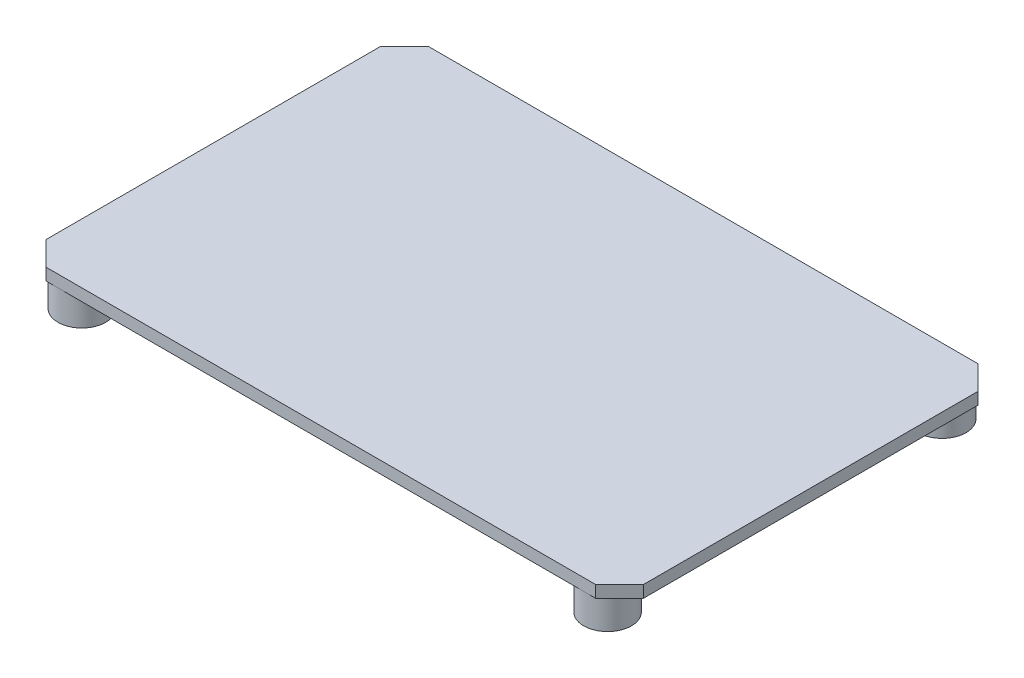
ISO-10303-21;
HEADER;
FILE_DESCRIPTION(('STEP AP214'),'2;1');
FILE_NAME('part.step','',(''),(''),'','','');
FILE_SCHEMA(('AUTOMOTIVE_DESIGN { 1 0 10303 214 1 1 1 1 }'));
ENDSEC;
DATA;
#1=APPLICATION_CONTEXT('core data for automotive mechanical design processes');
#2=APPLICATION_PROTOCOL_DEFINITION('international standard','automotive_design',2000,#1);
#3=PRODUCT_CONTEXT('',#1,'mechanical');
#4=PRODUCT('Part','Part','',(#3));
#5=PRODUCT_RELATED_PRODUCT_CATEGORY('part','',(#4));
#6=PRODUCT_DEFINITION_FORMATION('','',#4);
#7=PRODUCT_DEFINITION_CONTEXT('part definition',#1,'design');
#8=PRODUCT_DEFINITION('design','',#6,#7);
#9=PRODUCT_DEFINITION_SHAPE('','',#8);
#10=(LENGTH_UNIT() NAMED_UNIT(*) SI_UNIT(.MILLI.,.METRE.));
#11=(NAMED_UNIT(*) PLANE_ANGLE_UNIT() SI_UNIT($,.RADIAN.));
#12=(NAMED_UNIT(*) SI_UNIT($,.STERADIAN.) SOLID_ANGLE_UNIT());
#13=UNCERTAINTY_MEASURE_WITH_UNIT(LENGTH_MEASURE(1.E-05),#10,'distance_accuracy_value','');
#14=(GEOMETRIC_REPRESENTATION_CONTEXT(3) GLOBAL_UNCERTAINTY_ASSIGNED_CONTEXT((#13)) GLOBAL_UNIT_ASSIGNED_CONTEXT((#10,
#11,#12)) REPRESENTATION_CONTEXT('',''));
#15=CARTESIAN_POINT('',(0.,0.,0.));
#16=DIRECTION('',(0.,0.,1.));
#17=DIRECTION('',(1.,0.,0.));
#18=AXIS2_PLACEMENT_3D('',#15,#16,#17);
#19=CARTESIAN_POINT('',(-50.,19.4,80.));
#20=DIRECTION('',(0.707106781186547,0.,-0.707106781186547));
#21=DIRECTION('',(-0.707106781186548,0.,-0.707106781186548));
#22=AXIS2_PLACEMENT_3D('',#19,#20,#21);
#23=PLANE('',#22);
#24=DIRECTION('',(0.707106781186547,0.,0.707106781186547));
#25=VECTOR('',#24,1.);
#26=CARTESIAN_POINT('',(-50.,17.4,80.));
#27=LINE('',#26,#25);
#28=CARTESIAN_POINT('',(-50.,17.4,80.));
#29=VERTEX_POINT('',#28);
#30=CARTESIAN_POINT('',(-46.,17.4,84.));
#31=VERTEX_POINT('',#30);
#32=EDGE_CURVE('E143',#29,#31,#27,.T.);
#33=ORIENTED_EDGE('',*,*,#32,.T.);
#34=DIRECTION('',(0.,-1.,0.));
#35=VECTOR('',#34,1.);
#36=CARTESIAN_POINT('',(-46.,19.4,84.));
#37=LINE('',#36,#35);
#38=CARTESIAN_POINT('',(-46.,19.4,84.));
#39=VERTEX_POINT('',#38);
#40=EDGE_CURVE('E176',#39,#31,#37,.T.);
#41=ORIENTED_EDGE('',*,*,#40,.F.);
#42=DIRECTION('',(0.707106781186547,0.,0.707106781186547));
#43=VECTOR('',#42,1.);
#44=CARTESIAN_POINT('',(-50.,19.4,80.));
#45=LINE('',#44,#43);
#46=CARTESIAN_POINT('',(-50.,19.4,80.));
#47=VERTEX_POINT('',#46);
#48=EDGE_CURVE('E163',#47,#39,#45,.T.);
#49=ORIENTED_EDGE('',*,*,#48,.F.);
#50=DIRECTION('',(0.,-1.,0.));
#51=VECTOR('',#50,1.);
#52=CARTESIAN_POINT('',(-50.,19.4,80.));
#53=LINE('',#52,#51);
#54=EDGE_CURVE('E139',#47,#29,#53,.T.);
#55=ORIENTED_EDGE('',*,*,#54,.T.);
#56=EDGE_LOOP('',(#33,#41,#49,#55));
#57=FACE_BOUND('',#56,.T.);
#58=ADVANCED_FACE('F39',(#57),#23,.F.);
#59=CARTESIAN_POINT('',(-46.,19.4,84.));
#60=DIRECTION('',(0.,0.,-1.));
#61=DIRECTION('',(-1.,0.,0.));
#62=AXIS2_PLACEMENT_3D('',#59,#60,#61);
#63=PLANE('',#62);
#64=DIRECTION('',(1.,0.,0.));
#65=VECTOR('',#64,1.);
#66=CARTESIAN_POINT('',(-46.,17.4,84.));
#67=LINE('',#66,#65);
#68=CARTESIAN_POINT('',(-44.,17.4,84.));
#69=VERTEX_POINT('',#68);
#70=EDGE_CURVE('E148',#31,#69,#67,.T.);
#71=ORIENTED_EDGE('',*,*,#70,.T.);
#72=CARTESIAN_POINT('',(44.,17.4,84.));
#73=VERTEX_POINT('',#72);
#74=EDGE_CURVE('E152',#69,#73,#67,.T.);
#75=ORIENTED_EDGE('',*,*,#74,.T.);
#76=CARTESIAN_POINT('',(46.,17.4,84.));
#77=VERTEX_POINT('',#76);
#78=EDGE_CURVE('E146',#73,#77,#67,.T.);
#79=ORIENTED_EDGE('',*,*,#78,.T.);
#80=DIRECTION('',(0.,-1.,0.));
#81=VECTOR('',#80,1.);
#82=CARTESIAN_POINT('',(46.,19.4,84.));
#83=LINE('',#82,#81);
#84=CARTESIAN_POINT('',(46.,19.4,84.));
#85=VERTEX_POINT('',#84);
#86=EDGE_CURVE('E173',#85,#77,#83,.T.);
#87=ORIENTED_EDGE('',*,*,#86,.F.);
#88=DIRECTION('',(1.,0.,0.));
#89=VECTOR('',#88,1.);
#90=CARTESIAN_POINT('',(-46.,19.4,84.));
#91=LINE('',#90,#89);
#92=EDGE_CURVE('E102',#39,#85,#91,.T.);
#93=ORIENTED_EDGE('',*,*,#92,.F.);
#94=ORIENTED_EDGE('',*,*,#40,.T.);
#95=EDGE_LOOP('',(#71,#75,#79,#87,#93,#94));
#96=FACE_BOUND('',#95,.T.);
#97=ADVANCED_FACE('F260',(#96),#63,.F.);
#98=CARTESIAN_POINT('',(46.,19.4,84.));
#99=DIRECTION('',(-0.707106781186547,0.,-0.707106781186547));
#100=DIRECTION('',(-0.707106781186548,0.,0.707106781186548));
#101=AXIS2_PLACEMENT_3D('',#98,#99,#100);
#102=PLANE('',#101);
#103=DIRECTION('',(0.707106781186547,0.,-0.707106781186547));
#104=VECTOR('',#103,1.);
#105=CARTESIAN_POINT('',(46.,17.4,84.));
#106=LINE('',#105,#104);
#107=CARTESIAN_POINT('',(50.,17.4,80.));
#108=VERTEX_POINT('',#107);
#109=EDGE_CURVE('E151',#77,#108,#106,.T.);
#110=ORIENTED_EDGE('',*,*,#109,.T.);
#111=DIRECTION('',(0.,-1.,0.));
#112=VECTOR('',#111,1.);
#113=CARTESIAN_POINT('',(50.,19.4,80.));
#114=LINE('',#113,#112);
#115=CARTESIAN_POINT('',(50.,19.4,80.));
#116=VERTEX_POINT('',#115);
#117=EDGE_CURVE('E170',#116,#108,#114,.T.);
#118=ORIENTED_EDGE('',*,*,#117,.F.);
#119=DIRECTION('',(0.707106781186547,0.,-0.707106781186547));
#120=VECTOR('',#119,1.);
#121=CARTESIAN_POINT('',(46.,19.4,84.));
#122=LINE('',#121,#120);
#123=EDGE_CURVE('E217',#85,#116,#122,.T.);
#124=ORIENTED_EDGE('',*,*,#123,.F.);
#125=ORIENTED_EDGE('',*,*,#86,.T.);
#126=EDGE_LOOP('',(#110,#118,#124,#125));
#127=FACE_BOUND('',#126,.T.);
#128=ADVANCED_FACE('F266',(#127),#102,.F.);
#129=CARTESIAN_POINT('',(50.,19.4,80.));
#130=DIRECTION('',(-1.,0.,0.));
#131=DIRECTION('',(0.,0.,1.));
#132=AXIS2_PLACEMENT_3D('',#129,#130,#131);
#133=PLANE('',#132);
#134=DIRECTION('',(0.,0.,-1.));
#135=VECTOR('',#134,1.);
#136=CARTESIAN_POINT('',(50.,17.4,80.));
#137=LINE('',#136,#135);
#138=CARTESIAN_POINT('',(50.,17.4,24.));
#139=VERTEX_POINT('',#138);
#140=EDGE_CURVE('E154',#108,#139,#137,.T.);
#141=ORIENTED_EDGE('',*,*,#140,.T.);
#142=DIRECTION('',(0.,-1.,0.));
#143=VECTOR('',#142,1.);
#144=CARTESIAN_POINT('',(50.,19.4,24.));
#145=LINE('',#144,#143);
#146=CARTESIAN_POINT('',(50.,19.4,24.));
#147=VERTEX_POINT('',#146);
#148=EDGE_CURVE('E167',#147,#139,#145,.T.);
#149=ORIENTED_EDGE('',*,*,#148,.F.);
#150=DIRECTION('',(0.,0.,-1.));
#151=VECTOR('',#150,1.);
#152=CARTESIAN_POINT('',(50.,19.4,80.));
#153=LINE('',#152,#151);
#154=EDGE_CURVE('E219',#116,#147,#153,.T.);
#155=ORIENTED_EDGE('',*,*,#154,.F.);
#156=ORIENTED_EDGE('',*,*,#117,.T.);
#157=EDGE_LOOP('',(#141,#149,#155,#156));
#158=FACE_BOUND('',#157,.T.);
#159=ADVANCED_FACE('F225',(#158),#133,.F.);
#160=CARTESIAN_POINT('',(50.,19.4,24.));
#161=DIRECTION('',(-0.707106781186547,0.,0.707106781186548));
#162=DIRECTION('',(0.707106781186548,0.,0.707106781186547));
#163=AXIS2_PLACEMENT_3D('',#160,#161,#162);
#164=PLANE('',#163);
#165=DIRECTION('',(-0.707106781186548,0.,-0.707106781186547));
#166=VECTOR('',#165,1.);
#167=CARTESIAN_POINT('',(50.,17.4,24.));
#168=LINE('',#167,#166);
#169=CARTESIAN_POINT('',(46.,17.4,20.));
#170=VERTEX_POINT('',#169);
#171=EDGE_CURVE('E156',#139,#170,#168,.T.);
#172=ORIENTED_EDGE('',*,*,#171,.T.);
#173=DIRECTION('',(0.,-1.,0.));
#174=VECTOR('',#173,1.);
#175=CARTESIAN_POINT('',(46.,19.4,20.));
#176=LINE('',#175,#174);
#177=CARTESIAN_POINT('',(46.,19.4,20.));
#178=VERTEX_POINT('',#177);
#179=EDGE_CURVE('E134',#178,#170,#176,.T.);
#180=ORIENTED_EDGE('',*,*,#179,.F.);
#181=DIRECTION('',(-0.707106781186548,0.,-0.707106781186547));
#182=VECTOR('',#181,1.);
#183=CARTESIAN_POINT('',(50.,19.4,24.));
#184=LINE('',#183,#182);
#185=EDGE_CURVE('E123',#147,#178,#184,.T.);
#186=ORIENTED_EDGE('',*,*,#185,.F.);
#187=ORIENTED_EDGE('',*,*,#148,.T.);
#188=EDGE_LOOP('',(#172,#180,#186,#187));
#189=FACE_BOUND('',#188,.T.);
#190=ADVANCED_FACE('F229',(#189),#164,.F.);
#191=CARTESIAN_POINT('',(46.,19.4,20.));
#192=DIRECTION('',(0.,0.,1.));
#193=DIRECTION('',(1.,0.,0.));
#194=AXIS2_PLACEMENT_3D('',#191,#192,#193);
#195=PLANE('',#194);
#196=DIRECTION('',(-1.,0.,0.));
#197=VECTOR('',#196,1.);
#198=CARTESIAN_POINT('',(46.,17.4,20.));
#199=LINE('',#198,#197);
#200=CARTESIAN_POINT('',(44.,17.4,20.));
#201=VERTEX_POINT('',#200);
#202=EDGE_CURVE('E158',#170,#201,#199,.T.);
#203=ORIENTED_EDGE('',*,*,#202,.T.);
#204=CARTESIAN_POINT('',(-44.,17.4,20.));
#205=VERTEX_POINT('',#204);
#206=EDGE_CURVE('E160',#201,#205,#199,.T.);
#207=ORIENTED_EDGE('',*,*,#206,.T.);
#208=CARTESIAN_POINT('',(-46.,17.4,20.));
#209=VERTEX_POINT('',#208);
#210=EDGE_CURVE('E133',#205,#209,#199,.T.);
#211=ORIENTED_EDGE('',*,*,#210,.T.);
#212=DIRECTION('',(0.,-1.,0.));
#213=VECTOR('',#212,1.);
#214=CARTESIAN_POINT('',(-46.,19.4,20.));
#215=LINE('',#214,#213);
#216=CARTESIAN_POINT('',(-46.,19.4,20.));
#217=VERTEX_POINT('',#216);
#218=EDGE_CURVE('E128',#217,#209,#215,.T.);
#219=ORIENTED_EDGE('',*,*,#218,.F.);
#220=DIRECTION('',(-1.,0.,0.));
#221=VECTOR('',#220,1.);
#222=CARTESIAN_POINT('',(46.,19.4,20.));
#223=LINE('',#222,#221);
#224=EDGE_CURVE('E117',#178,#217,#223,.T.);
#225=ORIENTED_EDGE('',*,*,#224,.F.);
#226=ORIENTED_EDGE('',*,*,#179,.T.);
#227=EDGE_LOOP('',(#203,#207,#211,#219,#225,#226));
#228=FACE_BOUND('',#227,.T.);
#229=ADVANCED_FACE('F130',(#228),#195,.F.);
#230=CARTESIAN_POINT('',(-46.,19.4,20.));
#231=DIRECTION('',(0.707106781186547,0.,0.707106781186548));
#232=DIRECTION('',(0.707106781186548,0.,-0.707106781186547));
#233=AXIS2_PLACEMENT_3D('',#230,#231,#232);
#234=PLANE('',#233);
#235=DIRECTION('',(-0.707106781186548,0.,0.707106781186547));
#236=VECTOR('',#235,1.);
#237=CARTESIAN_POINT('',(-46.,17.4,20.));
#238=LINE('',#237,#236);
#239=CARTESIAN_POINT('',(-50.,17.4,24.));
#240=VERTEX_POINT('',#239);
#241=EDGE_CURVE('E87',#209,#240,#238,.T.);
#242=ORIENTED_EDGE('',*,*,#241,.T.);
#243=DIRECTION('',(0.,-1.,0.));
#244=VECTOR('',#243,1.);
#245=CARTESIAN_POINT('',(-50.,19.4,24.));
#246=LINE('',#245,#244);
#247=CARTESIAN_POINT('',(-50.,19.4,24.));
#248=VERTEX_POINT('',#247);
#249=EDGE_CURVE('E135',#248,#240,#246,.T.);
#250=ORIENTED_EDGE('',*,*,#249,.F.);
#251=DIRECTION('',(-0.707106781186548,0.,0.707106781186547));
#252=VECTOR('',#251,1.);
#253=CARTESIAN_POINT('',(-46.,19.4,20.));
#254=LINE('',#253,#252);
#255=EDGE_CURVE('E121',#217,#248,#254,.T.);
#256=ORIENTED_EDGE('',*,*,#255,.F.);
#257=ORIENTED_EDGE('',*,*,#218,.T.);
#258=EDGE_LOOP('',(#242,#250,#256,#257));
#259=FACE_BOUND('',#258,.T.);
#260=ADVANCED_FACE('F137',(#259),#234,.F.);
#261=CARTESIAN_POINT('',(-50.,19.4,24.));
#262=DIRECTION('',(1.,0.,0.));
#263=DIRECTION('',(0.,0.,-1.));
#264=AXIS2_PLACEMENT_3D('',#261,#262,#263);
#265=PLANE('',#264);
#266=DIRECTION('',(0.,0.,1.));
#267=VECTOR('',#266,1.);
#268=CARTESIAN_POINT('',(-50.,17.4,24.));
#269=LINE('',#268,#267);
#270=EDGE_CURVE('E93',#240,#29,#269,.T.);
#271=ORIENTED_EDGE('',*,*,#270,.T.);
#272=ORIENTED_EDGE('',*,*,#54,.F.);
#273=DIRECTION('',(0.,0.,1.));
#274=VECTOR('',#273,1.);
#275=CARTESIAN_POINT('',(-50.,19.4,24.));
#276=LINE('',#275,#274);
#277=EDGE_CURVE('E57',#248,#47,#276,.T.);
#278=ORIENTED_EDGE('',*,*,#277,.F.);
#279=ORIENTED_EDGE('',*,*,#249,.T.);
#280=EDGE_LOOP('',(#271,#272,#278,#279));
#281=FACE_BOUND('',#280,.T.);
#282=ADVANCED_FACE('F288',(#281),#265,.F.);
#283=CARTESIAN_POINT('',(0.,19.4,0.));
#284=DIRECTION('',(0.,1.,0.));
#285=DIRECTION('',(0.,0.,1.));
#286=AXIS2_PLACEMENT_3D('',#283,#284,#285);
#287=PLANE('',#286);
#288=ORIENTED_EDGE('',*,*,#48,.T.);
#289=ORIENTED_EDGE('',*,*,#92,.T.);
#290=ORIENTED_EDGE('',*,*,#123,.T.);
#291=ORIENTED_EDGE('',*,*,#154,.T.);
#292=ORIENTED_EDGE('',*,*,#185,.T.);
#293=ORIENTED_EDGE('',*,*,#224,.T.);
#294=ORIENTED_EDGE('',*,*,#255,.T.);
#295=ORIENTED_EDGE('',*,*,#277,.T.);
#296=EDGE_LOOP('',(#288,#289,#290,#291,#292,#293,#294,#295));
#297=FACE_BOUND('',#296,.T.);
#298=ADVANCED_FACE('F119',(#297),#287,.T.);
#299=CARTESIAN_POINT('',(0.,17.4,0.));
#300=DIRECTION('',(0.,1.,0.));
#301=DIRECTION('',(0.,0.,1.));
#302=AXIS2_PLACEMENT_3D('',#299,#300,#301);
#303=PLANE('',#302);
#304=ORIENTED_EDGE('',*,*,#74,.F.);
#305=CARTESIAN_POINT('',(-44.,17.4,80.));
#306=DIRECTION('',(0.,1.,0.));
#307=DIRECTION('',(0.,0.,1.));
#308=AXIS2_PLACEMENT_3D('',#305,#306,#307);
#309=CIRCLE('',#308,4.);
#310=EDGE_CURVE('E11',#69,#69,#309,.F.);
#311=ORIENTED_EDGE('',*,*,#310,.F.);
#312=ORIENTED_EDGE('',*,*,#70,.F.);
#313=ORIENTED_EDGE('',*,*,#32,.F.);
#314=ORIENTED_EDGE('',*,*,#270,.F.);
#315=ORIENTED_EDGE('',*,*,#241,.F.);
#316=ORIENTED_EDGE('',*,*,#210,.F.);
#317=CARTESIAN_POINT('',(-44.,17.4,24.));
#318=DIRECTION('',(0.,1.,0.));
#319=DIRECTION('',(0.,0.,1.));
#320=AXIS2_PLACEMENT_3D('',#317,#318,#319);
#321=CIRCLE('',#320,4.);
#322=EDGE_CURVE('E178',#205,#205,#321,.F.);
#323=ORIENTED_EDGE('',*,*,#322,.F.);
#324=ORIENTED_EDGE('',*,*,#206,.F.);
#325=CARTESIAN_POINT('',(44.,17.4,24.));
#326=DIRECTION('',(0.,1.,0.));
#327=DIRECTION('',(0.,0.,1.));
#328=AXIS2_PLACEMENT_3D('',#325,#326,#327);
#329=CIRCLE('',#328,4.);
#330=EDGE_CURVE('E48',#201,#201,#329,.F.);
#331=ORIENTED_EDGE('',*,*,#330,.F.);
#332=ORIENTED_EDGE('',*,*,#202,.F.);
#333=ORIENTED_EDGE('',*,*,#171,.F.);
#334=ORIENTED_EDGE('',*,*,#140,.F.);
#335=ORIENTED_EDGE('',*,*,#109,.F.);
#336=ORIENTED_EDGE('',*,*,#78,.F.);
#337=CARTESIAN_POINT('',(44.,17.4,80.));
#338=DIRECTION('',(0.,1.,0.));
#339=DIRECTION('',(0.,0.,1.));
#340=AXIS2_PLACEMENT_3D('',#337,#338,#339);
#341=CIRCLE('',#340,4.);
#342=EDGE_CURVE('E181',#73,#73,#341,.F.);
#343=ORIENTED_EDGE('',*,*,#342,.F.);
#344=EDGE_LOOP('',(#304,#311,#312,#313,#314,#315,#316,#323,#324,#331,#332,#333,#334,#335,#336,#343));
#345=FACE_BOUND('',#344,.T.);
#346=ADVANCED_FACE('F236',(#345),#303,.F.);
#347=CARTESIAN_POINT('',(-44.,17.5,24.));
#348=DIRECTION('',(0.,-1.,0.));
#349=DIRECTION('',(0.,0.,-1.));
#350=AXIS2_PLACEMENT_3D('',#347,#348,#349);
#351=CYLINDRICAL_SURFACE('',#350,4.);
#352=CARTESIAN_POINT('',(-44.,12.4,24.));
#353=DIRECTION('',(0.,1.,0.));
#354=DIRECTION('',(0.,0.,1.));
#355=AXIS2_PLACEMENT_3D('',#352,#353,#354);
#356=CIRCLE('',#355,4.);
#357=CARTESIAN_POINT('',(-44.,12.4,28.));
#358=VERTEX_POINT('',#357);
#359=EDGE_CURVE('E147',#358,#358,#356,.T.);
#360=ORIENTED_EDGE('',*,*,#359,.T.);
#361=EDGE_LOOP('',(#360));
#362=FACE_BOUND('',#361,.T.);
#363=ORIENTED_EDGE('',*,*,#322,.T.);
#364=EDGE_LOOP('',(#363));
#365=FACE_BOUND('',#364,.T.);
#366=ADVANCED_FACE('F293',(#362,#365),#351,.T.);
#367=CARTESIAN_POINT('',(-44.,12.4,24.));
#368=DIRECTION('',(0.,1.,0.));
#369=DIRECTION('',(0.,0.,1.));
#370=AXIS2_PLACEMENT_3D('',#367,#368,#369);
#371=PLANE('',#370);
#372=CARTESIAN_POINT('',(-44.,12.4,24.));
#373=DIRECTION('',(0.,1.,0.));
#374=DIRECTION('',(0.,0.,1.));
#375=AXIS2_PLACEMENT_3D('',#372,#373,#374);
#376=CIRCLE('',#375,1.25);
#377=CARTESIAN_POINT('',(-44.,12.4,25.25));
#378=VERTEX_POINT('',#377);
#379=EDGE_CURVE('E42',#378,#378,#376,.F.);
#380=ORIENTED_EDGE('',*,*,#379,.F.);
#381=EDGE_LOOP('',(#380));
#382=FACE_BOUND('',#381,.T.);
#383=ORIENTED_EDGE('',*,*,#359,.F.);
#384=EDGE_LOOP('',(#383));
#385=FACE_BOUND('',#384,.T.);
#386=ADVANCED_FACE('F298',(#382,#385),#371,.F.);
#387=CARTESIAN_POINT('',(44.,17.5,80.));
#388=DIRECTION('',(0.,-1.,0.));
#389=DIRECTION('',(0.,0.,-1.));
#390=AXIS2_PLACEMENT_3D('',#387,#388,#389);
#391=CYLINDRICAL_SURFACE('',#390,4.);
#392=CARTESIAN_POINT('',(44.,12.4,80.));
#393=DIRECTION('',(0.,1.,0.));
#394=DIRECTION('',(0.,0.,1.));
#395=AXIS2_PLACEMENT_3D('',#392,#393,#394);
#396=CIRCLE('',#395,4.);
#397=CARTESIAN_POINT('',(44.,12.4,84.));
#398=VERTEX_POINT('',#397);
#399=EDGE_CURVE('E197',#398,#398,#396,.T.);
#400=ORIENTED_EDGE('',*,*,#399,.T.);
#401=EDGE_LOOP('',(#400));
#402=FACE_BOUND('',#401,.T.);
#403=ORIENTED_EDGE('',*,*,#342,.T.);
#404=EDGE_LOOP('',(#403));
#405=FACE_BOUND('',#404,.T.);
#406=ADVANCED_FACE('F255',(#402,#405),#391,.T.);
#407=CARTESIAN_POINT('',(44.,12.4,80.));
#408=DIRECTION('',(0.,1.,0.));
#409=DIRECTION('',(0.,0.,1.));
#410=AXIS2_PLACEMENT_3D('',#407,#408,#409);
#411=PLANE('',#410);
#412=CARTESIAN_POINT('',(44.,12.4,80.));
#413=DIRECTION('',(0.,1.,0.));
#414=DIRECTION('',(0.,0.,1.));
#415=AXIS2_PLACEMENT_3D('',#412,#413,#414);
#416=CIRCLE('',#415,1.25);
#417=CARTESIAN_POINT('',(44.,12.4,81.25));
#418=VERTEX_POINT('',#417);
#419=EDGE_CURVE('E192',#418,#418,#416,.F.);
#420=ORIENTED_EDGE('',*,*,#419,.F.);
#421=EDGE_LOOP('',(#420));
#422=FACE_BOUND('',#421,.T.);
#423=ORIENTED_EDGE('',*,*,#399,.F.);
#424=EDGE_LOOP('',(#423));
#425=FACE_BOUND('',#424,.T.);
#426=ADVANCED_FACE('F243',(#422,#425),#411,.F.);
#427=CARTESIAN_POINT('',(44.,17.5,24.));
#428=DIRECTION('',(0.,-1.,0.));
#429=DIRECTION('',(0.,0.,-1.));
#430=AXIS2_PLACEMENT_3D('',#427,#428,#429);
#431=CYLINDRICAL_SURFACE('',#430,4.);
#432=CARTESIAN_POINT('',(44.,12.4,24.));
#433=DIRECTION('',(0.,1.,0.));
#434=DIRECTION('',(0.,0.,1.));
#435=AXIS2_PLACEMENT_3D('',#432,#433,#434);
#436=CIRCLE('',#435,4.);
#437=CARTESIAN_POINT('',(44.,12.4,28.));
#438=VERTEX_POINT('',#437);
#439=EDGE_CURVE('E201',#438,#438,#436,.T.);
#440=ORIENTED_EDGE('',*,*,#439,.T.);
#441=EDGE_LOOP('',(#440));
#442=FACE_BOUND('',#441,.T.);
#443=ORIENTED_EDGE('',*,*,#330,.T.);
#444=EDGE_LOOP('',(#443));
#445=FACE_BOUND('',#444,.T.);
#446=ADVANCED_FACE('F240',(#442,#445),#431,.T.);
#447=CARTESIAN_POINT('',(44.,12.4,24.));
#448=DIRECTION('',(0.,1.,0.));
#449=DIRECTION('',(0.,0.,1.));
#450=AXIS2_PLACEMENT_3D('',#447,#448,#449);
#451=PLANE('',#450);
#452=CARTESIAN_POINT('',(44.,12.4,24.));
#453=DIRECTION('',(0.,1.,0.));
#454=DIRECTION('',(0.,0.,1.));
#455=AXIS2_PLACEMENT_3D('',#452,#453,#454);
#456=CIRCLE('',#455,1.25);
#457=CARTESIAN_POINT('',(44.,12.4,25.25));
#458=VERTEX_POINT('',#457);
#459=EDGE_CURVE('E189',#458,#458,#456,.F.);
#460=ORIENTED_EDGE('',*,*,#459,.F.);
#461=EDGE_LOOP('',(#460));
#462=FACE_BOUND('',#461,.T.);
#463=ORIENTED_EDGE('',*,*,#439,.F.);
#464=EDGE_LOOP('',(#463));
#465=FACE_BOUND('',#464,.T.);
#466=ADVANCED_FACE('F242',(#462,#465),#451,.F.);
#467=CARTESIAN_POINT('',(-44.,17.5,80.));
#468=DIRECTION('',(0.,-1.,0.));
#469=DIRECTION('',(0.,0.,-1.));
#470=AXIS2_PLACEMENT_3D('',#467,#468,#469);
#471=CYLINDRICAL_SURFACE('',#470,4.);
#472=CARTESIAN_POINT('',(-44.,12.4,80.));
#473=DIRECTION('',(0.,1.,0.));
#474=DIRECTION('',(0.,0.,1.));
#475=AXIS2_PLACEMENT_3D('',#472,#473,#474);
#476=CIRCLE('',#475,4.);
#477=CARTESIAN_POINT('',(-44.,12.4,84.));
#478=VERTEX_POINT('',#477);
#479=EDGE_CURVE('E206',#478,#478,#476,.T.);
#480=ORIENTED_EDGE('',*,*,#479,.T.);
#481=EDGE_LOOP('',(#480));
#482=FACE_BOUND('',#481,.T.);
#483=ORIENTED_EDGE('',*,*,#310,.T.);
#484=EDGE_LOOP('',(#483));
#485=FACE_BOUND('',#484,.T.);
#486=ADVANCED_FACE('F251',(#482,#485),#471,.T.);
#487=CARTESIAN_POINT('',(-44.,12.4,80.));
#488=DIRECTION('',(0.,1.,0.));
#489=DIRECTION('',(0.,0.,1.));
#490=AXIS2_PLACEMENT_3D('',#487,#488,#489);
#491=PLANE('',#490);
#492=CARTESIAN_POINT('',(-44.,12.4,80.));
#493=DIRECTION('',(0.,1.,0.));
#494=DIRECTION('',(0.,0.,1.));
#495=AXIS2_PLACEMENT_3D('',#492,#493,#494);
#496=CIRCLE('',#495,1.25);
#497=CARTESIAN_POINT('',(-44.,12.4,81.25));
#498=VERTEX_POINT('',#497);
#499=EDGE_CURVE('E186',#498,#498,#496,.F.);
#500=ORIENTED_EDGE('',*,*,#499,.F.);
#501=EDGE_LOOP('',(#500));
#502=FACE_BOUND('',#501,.T.);
#503=ORIENTED_EDGE('',*,*,#479,.F.);
#504=EDGE_LOOP('',(#503));
#505=FACE_BOUND('',#504,.T.);
#506=ADVANCED_FACE('F318',(#502,#505),#491,.F.);
#507=CARTESIAN_POINT('',(-44.,18.4,80.));
#508=DIRECTION('',(0.,-1.,0.));
#509=DIRECTION('',(0.,0.,-1.));
#510=AXIS2_PLACEMENT_3D('',#507,#508,#509);
#511=CYLINDRICAL_SURFACE('',#510,1.25);
#512=CARTESIAN_POINT('',(-44.,18.4,80.));
#513=DIRECTION('',(0.,1.,0.));
#514=DIRECTION('',(0.,0.,1.));
#515=AXIS2_PLACEMENT_3D('',#512,#513,#514);
#516=CIRCLE('',#515,1.25);
#517=CARTESIAN_POINT('',(-44.,18.4,81.25));
#518=VERTEX_POINT('',#517);
#519=EDGE_CURVE('E361',#518,#518,#516,.T.);
#520=ORIENTED_EDGE('',*,*,#519,.T.);
#521=EDGE_LOOP('',(#520));
#522=FACE_BOUND('',#521,.T.);
#523=ORIENTED_EDGE('',*,*,#499,.T.);
#524=EDGE_LOOP('',(#523));
#525=FACE_BOUND('',#524,.T.);
#526=ADVANCED_FACE('F321',(#522,#525),#511,.F.);
#527=CARTESIAN_POINT('',(-44.,18.4,80.));
#528=DIRECTION('',(0.,1.,0.));
#529=DIRECTION('',(0.,0.,1.));
#530=AXIS2_PLACEMENT_3D('',#527,#528,#529);
#531=PLANE('',#530);
#532=ORIENTED_EDGE('',*,*,#519,.F.);
#533=EDGE_LOOP('',(#532));
#534=FACE_BOUND('',#533,.T.);
#535=ADVANCED_FACE('F326',(#534),#531,.F.);
#536=CARTESIAN_POINT('',(44.,18.4,24.));
#537=DIRECTION('',(0.,-1.,0.));
#538=DIRECTION('',(0.,0.,-1.));
#539=AXIS2_PLACEMENT_3D('',#536,#537,#538);
#540=CYLINDRICAL_SURFACE('',#539,1.25);
#541=CARTESIAN_POINT('',(44.,18.4,24.));
#542=DIRECTION('',(0.,1.,0.));
#543=DIRECTION('',(0.,0.,1.));
#544=AXIS2_PLACEMENT_3D('',#541,#542,#543);
#545=CIRCLE('',#544,1.25);
#546=CARTESIAN_POINT('',(44.,18.4,25.25));
#547=VERTEX_POINT('',#546);
#548=EDGE_CURVE('E362',#547,#547,#545,.T.);
#549=ORIENTED_EDGE('',*,*,#548,.T.);
#550=EDGE_LOOP('',(#549));
#551=FACE_BOUND('',#550,.T.);
#552=ORIENTED_EDGE('',*,*,#459,.T.);
#553=EDGE_LOOP('',(#552));
#554=FACE_BOUND('',#553,.T.);
#555=ADVANCED_FACE('F337',(#551,#554),#540,.F.);
#556=CARTESIAN_POINT('',(44.,18.4,24.));
#557=DIRECTION('',(0.,1.,0.));
#558=DIRECTION('',(0.,0.,1.));
#559=AXIS2_PLACEMENT_3D('',#556,#557,#558);
#560=PLANE('',#559);
#561=ORIENTED_EDGE('',*,*,#548,.F.);
#562=EDGE_LOOP('',(#561));
#563=FACE_BOUND('',#562,.T.);
#564=ADVANCED_FACE('F347',(#563),#560,.F.);
#565=CARTESIAN_POINT('',(44.,18.4,80.));
#566=DIRECTION('',(0.,-1.,0.));
#567=DIRECTION('',(0.,0.,-1.));
#568=AXIS2_PLACEMENT_3D('',#565,#566,#567);
#569=CYLINDRICAL_SURFACE('',#568,1.25);
#570=CARTESIAN_POINT('',(44.,18.4,80.));
#571=DIRECTION('',(0.,1.,0.));
#572=DIRECTION('',(0.,0.,1.));
#573=AXIS2_PLACEMENT_3D('',#570,#571,#572);
#574=CIRCLE('',#573,1.25);
#575=CARTESIAN_POINT('',(44.,18.4,81.25));
#576=VERTEX_POINT('',#575);
#577=EDGE_CURVE('E366',#576,#576,#574,.T.);
#578=ORIENTED_EDGE('',*,*,#577,.T.);
#579=EDGE_LOOP('',(#578));
#580=FACE_BOUND('',#579,.T.);
#581=ORIENTED_EDGE('',*,*,#419,.T.);
#582=EDGE_LOOP('',(#581));
#583=FACE_BOUND('',#582,.T.);
#584=ADVANCED_FACE('F350',(#580,#583),#569,.F.);
#585=CARTESIAN_POINT('',(44.,18.4,80.));
#586=DIRECTION('',(0.,1.,0.));
#587=DIRECTION('',(0.,0.,1.));
#588=AXIS2_PLACEMENT_3D('',#585,#586,#587);
#589=PLANE('',#588);
#590=ORIENTED_EDGE('',*,*,#577,.F.);
#591=EDGE_LOOP('',(#590));
#592=FACE_BOUND('',#591,.T.);
#593=ADVANCED_FACE('F342',(#592),#589,.F.);
#594=CARTESIAN_POINT('',(-44.,18.4,24.));
#595=DIRECTION('',(0.,-1.,0.));
#596=DIRECTION('',(0.,0.,-1.));
#597=AXIS2_PLACEMENT_3D('',#594,#595,#596);
#598=CYLINDRICAL_SURFACE('',#597,1.25);
#599=CARTESIAN_POINT('',(-44.,18.4,24.));
#600=DIRECTION('',(0.,1.,0.));
#601=DIRECTION('',(0.,0.,1.));
#602=AXIS2_PLACEMENT_3D('',#599,#600,#601);
#603=CIRCLE('',#602,1.25);
#604=CARTESIAN_POINT('',(-44.,18.4,25.25));
#605=VERTEX_POINT('',#604);
#606=EDGE_CURVE('E190',#605,#605,#603,.T.);
#607=ORIENTED_EDGE('',*,*,#606,.T.);
#608=EDGE_LOOP('',(#607));
#609=FACE_BOUND('',#608,.T.);
#610=ORIENTED_EDGE('',*,*,#379,.T.);
#611=EDGE_LOOP('',(#610));
#612=FACE_BOUND('',#611,.T.);
#613=ADVANCED_FACE('F315',(#609,#612),#598,.F.);
#614=CARTESIAN_POINT('',(-44.,18.4,24.));
#615=DIRECTION('',(0.,1.,0.));
#616=DIRECTION('',(0.,0.,1.));
#617=AXIS2_PLACEMENT_3D('',#614,#615,#616);
#618=PLANE('',#617);
#619=ORIENTED_EDGE('',*,*,#606,.F.);
#620=EDGE_LOOP('',(#619));
#621=FACE_BOUND('',#620,.T.);
#622=ADVANCED_FACE('F352',(#621),#618,.F.);
#623=CLOSED_SHELL('',(#58,#97,#128,#159,#190,#229,#260,#282,#298,#346,#366,#386,#406,#426,#446,
#466,#486,#506,#526,#535,#555,#564,#584,#593,#613,#622));
#624=MANIFOLD_SOLID_BREP('B2',#623);
#625=ADVANCED_BREP_SHAPE_REPRESENTATION('',(#18,#624),#14);
#626=SHAPE_DEFINITION_REPRESENTATION(#9,#625);
ENDSEC;
END-ISO-10303-21;
